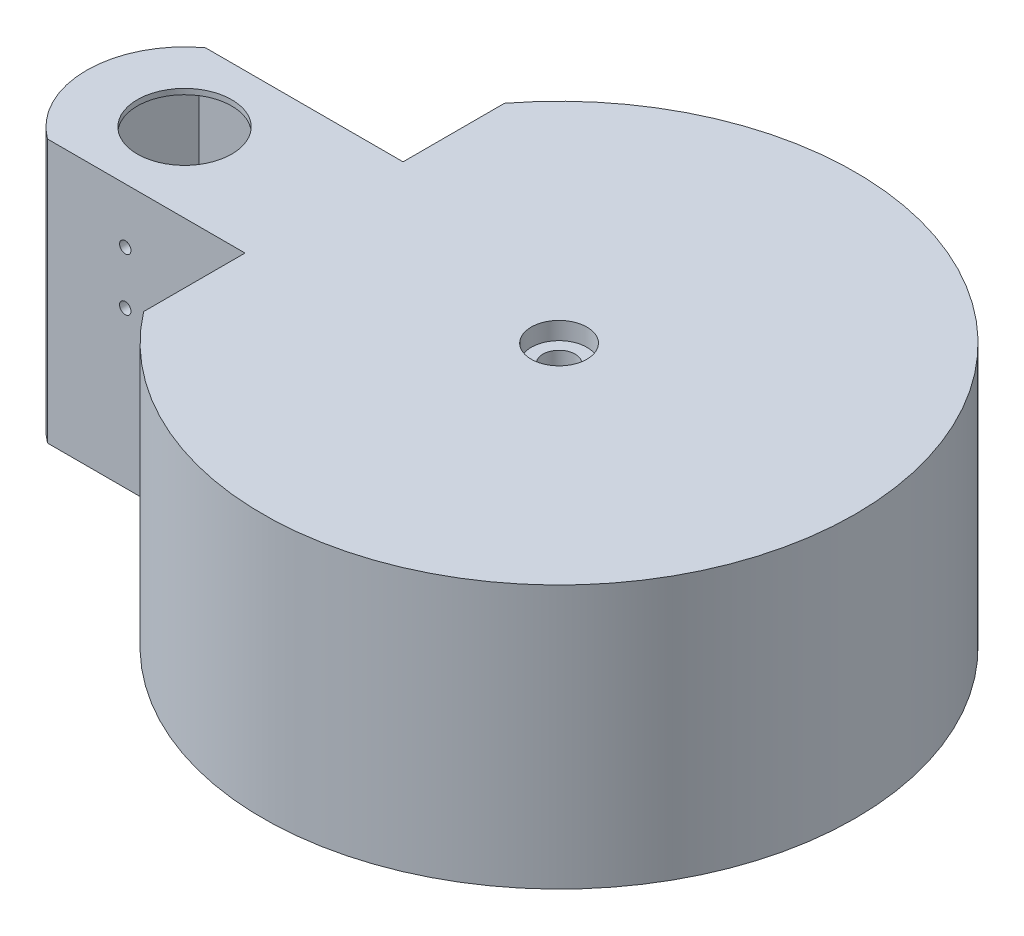
ISO-10303-21;
HEADER;
FILE_DESCRIPTION(('STEP AP214'),'2;1');
FILE_NAME('part.step','',(''),(''),'','','');
FILE_SCHEMA(('AUTOMOTIVE_DESIGN { 1 0 10303 214 1 1 1 1 }'));
ENDSEC;
DATA;
#1=APPLICATION_CONTEXT('core data for automotive mechanical design processes');
#2=APPLICATION_PROTOCOL_DEFINITION('international standard','automotive_design',2000,#1);
#3=PRODUCT_CONTEXT('',#1,'mechanical');
#4=PRODUCT('Part','Part','',(#3));
#5=PRODUCT_RELATED_PRODUCT_CATEGORY('part','',(#4));
#6=PRODUCT_DEFINITION_FORMATION('','',#4);
#7=PRODUCT_DEFINITION_CONTEXT('part definition',#1,'design');
#8=PRODUCT_DEFINITION('design','',#6,#7);
#9=PRODUCT_DEFINITION_SHAPE('','',#8);
#10=(LENGTH_UNIT() NAMED_UNIT(*) SI_UNIT(.MILLI.,.METRE.));
#11=(NAMED_UNIT(*) PLANE_ANGLE_UNIT() SI_UNIT($,.RADIAN.));
#12=(NAMED_UNIT(*) SI_UNIT($,.STERADIAN.) SOLID_ANGLE_UNIT());
#13=UNCERTAINTY_MEASURE_WITH_UNIT(LENGTH_MEASURE(1.E-05),#10,'distance_accuracy_value','');
#14=(GEOMETRIC_REPRESENTATION_CONTEXT(3) GLOBAL_UNCERTAINTY_ASSIGNED_CONTEXT((#13)) GLOBAL_UNIT_ASSIGNED_CONTEXT((#10,
#11,#12)) REPRESENTATION_CONTEXT('',''));
#15=CARTESIAN_POINT('',(0.,0.,0.));
#16=DIRECTION('',(0.,0.,1.));
#17=DIRECTION('',(1.,0.,0.));
#18=AXIS2_PLACEMENT_3D('',#15,#16,#17);
#19=CARTESIAN_POINT('',(0.,60.,0.));
#20=DIRECTION('',(0.,-1.,0.));
#21=DIRECTION('',(0.,0.,-1.));
#22=AXIS2_PLACEMENT_3D('',#19,#20,#21);
#23=CYLINDRICAL_SURFACE('',#22,3.675);
#24=CARTESIAN_POINT('',(0.,4.,0.));
#25=DIRECTION('',(0.,-1.,0.));
#26=DIRECTION('',(0.,0.,-1.));
#27=AXIS2_PLACEMENT_3D('',#24,#25,#26);
#28=CIRCLE('',#27,3.675);
#29=CARTESIAN_POINT('',(0.,4.,-3.675));
#30=VERTEX_POINT('',#29);
#31=EDGE_CURVE('E174',#30,#30,#28,.T.);
#32=ORIENTED_EDGE('',*,*,#31,.T.);
#33=EDGE_LOOP('',(#32));
#34=FACE_BOUND('',#33,.T.);
#35=CARTESIAN_POINT('',(0.,56.,0.));
#36=DIRECTION('',(0.,1.,0.));
#37=DIRECTION('',(0.,0.,1.));
#38=AXIS2_PLACEMENT_3D('',#35,#36,#37);
#39=CIRCLE('',#38,3.675);
#40=CARTESIAN_POINT('',(0.,56.,3.675));
#41=VERTEX_POINT('',#40);
#42=EDGE_CURVE('E45',#41,#41,#39,.T.);
#43=ORIENTED_EDGE('',*,*,#42,.T.);
#44=EDGE_LOOP('',(#43));
#45=FACE_BOUND('',#44,.T.);
#46=ADVANCED_FACE('F41',(#34,#45),#23,.F.);
#47=CARTESIAN_POINT('',(0.,60.,18.));
#48=DIRECTION('',(0.,0.,-1.));
#49=DIRECTION('',(-1.,0.,0.));
#50=AXIS2_PLACEMENT_3D('',#47,#48,#49);
#51=PLANE('',#50);
#52=CARTESIAN_POINT('',(-56.83,47.5,18.));
#53=DIRECTION('',(0.,0.,-1.));
#54=DIRECTION('',(-1.,0.,0.));
#55=AXIS2_PLACEMENT_3D('',#52,#53,#54);
#56=CIRCLE('',#55,1.29999999999999);
#57=CARTESIAN_POINT('',(-58.13,47.5,18.));
#58=VERTEX_POINT('',#57);
#59=EDGE_CURVE('E199',#58,#58,#56,.T.);
#60=ORIENTED_EDGE('',*,*,#59,.T.);
#61=EDGE_LOOP('',(#60));
#62=FACE_BOUND('',#61,.T.);
#63=CARTESIAN_POINT('',(-80.83,47.5,18.));
#64=DIRECTION('',(0.,0.,-1.));
#65=DIRECTION('',(-1.,0.,0.));
#66=AXIS2_PLACEMENT_3D('',#63,#64,#65);
#67=CIRCLE('',#66,1.29999999999999);
#68=CARTESIAN_POINT('',(-82.13,47.5,18.));
#69=VERTEX_POINT('',#68);
#70=EDGE_CURVE('E206',#69,#69,#67,.T.);
#71=ORIENTED_EDGE('',*,*,#70,.T.);
#72=EDGE_LOOP('',(#71));
#73=FACE_BOUND('',#72,.T.);
#74=CARTESIAN_POINT('',(-80.83,35.5,18.));
#75=DIRECTION('',(0.,0.,-1.));
#76=DIRECTION('',(-1.,0.,0.));
#77=AXIS2_PLACEMENT_3D('',#74,#75,#76);
#78=CIRCLE('',#77,1.29999999999999);
#79=CARTESIAN_POINT('',(-82.13,35.5,18.));
#80=VERTEX_POINT('',#79);
#81=EDGE_CURVE('E218',#80,#80,#78,.T.);
#82=ORIENTED_EDGE('',*,*,#81,.T.);
#83=EDGE_LOOP('',(#82));
#84=FACE_BOUND('',#83,.T.);
#85=CARTESIAN_POINT('',(-56.83,35.5,18.));
#86=DIRECTION('',(0.,0.,-1.));
#87=DIRECTION('',(-1.,0.,0.));
#88=AXIS2_PLACEMENT_3D('',#85,#86,#87);
#89=CIRCLE('',#88,1.29999999999999);
#90=CARTESIAN_POINT('',(-58.13,35.5,18.));
#91=VERTEX_POINT('',#90);
#92=EDGE_CURVE('E225',#91,#91,#89,.T.);
#93=ORIENTED_EDGE('',*,*,#92,.T.);
#94=EDGE_LOOP('',(#93));
#95=FACE_BOUND('',#94,.T.);
#96=DIRECTION('',(1.,0.,0.));
#97=VECTOR('',#96,1.);
#98=CARTESIAN_POINT('',(0.,0.,18.));
#99=LINE('',#98,#97);
#100=CARTESIAN_POINT('',(-98.5447228499125,0.,18.));
#101=VERTEX_POINT('',#100);
#102=CARTESIAN_POINT('',(-53.5447228499125,0.,18.));
#103=VERTEX_POINT('',#102);
#104=EDGE_CURVE('E143',#101,#103,#99,.T.);
#105=ORIENTED_EDGE('',*,*,#104,.T.);
#106=DIRECTION('',(0.,-1.,0.));
#107=VECTOR('',#106,1.);
#108=CARTESIAN_POINT('',(-53.5447228499125,60.,18.));
#109=LINE('',#108,#107);
#110=CARTESIAN_POINT('',(-53.5447228499125,60.,18.));
#111=VERTEX_POINT('',#110);
#112=EDGE_CURVE('E12',#111,#103,#109,.T.);
#113=ORIENTED_EDGE('',*,*,#112,.F.);
#114=DIRECTION('',(1.,0.,0.));
#115=VECTOR('',#114,1.);
#116=CARTESIAN_POINT('',(0.,60.,18.));
#117=LINE('',#116,#115);
#118=CARTESIAN_POINT('',(-98.5447228499125,60.,18.));
#119=VERTEX_POINT('',#118);
#120=EDGE_CURVE('E156',#119,#111,#117,.T.);
#121=ORIENTED_EDGE('',*,*,#120,.F.);
#122=DIRECTION('',(0.,-1.,0.));
#123=VECTOR('',#122,1.);
#124=CARTESIAN_POINT('',(-98.5447228499125,60.,18.));
#125=LINE('',#124,#123);
#126=EDGE_CURVE('E142',#119,#101,#125,.T.);
#127=ORIENTED_EDGE('',*,*,#126,.T.);
#128=EDGE_LOOP('',(#105,#113,#121,#127));
#129=FACE_BOUND('',#128,.T.);
#130=ADVANCED_FACE('F43',(#62,#73,#84,#95,#129),#51,.F.);
#131=CARTESIAN_POINT('',(-53.5447228499125,60.,0.));
#132=DIRECTION('',(1.,0.,0.));
#133=DIRECTION('',(0.,0.,-1.));
#134=AXIS2_PLACEMENT_3D('',#131,#132,#133);
#135=PLANE('',#134);
#136=DIRECTION('',(0.,0.,1.));
#137=VECTOR('',#136,1.);
#138=CARTESIAN_POINT('',(-53.5447228499125,0.,0.));
#139=LINE('',#138,#137);
#140=CARTESIAN_POINT('',(-53.5447228499125,0.,41.1000322983578));
#141=VERTEX_POINT('',#140);
#142=EDGE_CURVE('E146',#103,#141,#139,.T.);
#143=ORIENTED_EDGE('',*,*,#142,.T.);
#144=DIRECTION('',(0.,-1.,0.));
#145=VECTOR('',#144,1.);
#146=CARTESIAN_POINT('',(-53.5447228499125,60.,41.1000322983578));
#147=LINE('',#146,#145);
#148=CARTESIAN_POINT('',(-53.5447228499125,60.,41.1000322983578));
#149=VERTEX_POINT('',#148);
#150=EDGE_CURVE('E50',#149,#141,#147,.T.);
#151=ORIENTED_EDGE('',*,*,#150,.F.);
#152=DIRECTION('',(0.,0.,1.));
#153=VECTOR('',#152,1.);
#154=CARTESIAN_POINT('',(-53.5447228499125,60.,0.));
#155=LINE('',#154,#153);
#156=EDGE_CURVE('E102',#111,#149,#155,.T.);
#157=ORIENTED_EDGE('',*,*,#156,.F.);
#158=ORIENTED_EDGE('',*,*,#112,.T.);
#159=EDGE_LOOP('',(#143,#151,#157,#158));
#160=FACE_BOUND('',#159,.T.);
#161=ADVANCED_FACE('F262',(#160),#135,.F.);
#162=CARTESIAN_POINT('',(0.,60.,0.));
#163=DIRECTION('',(0.,-1.,0.));
#164=DIRECTION('',(0.,0.,-1.));
#165=AXIS2_PLACEMENT_3D('',#162,#163,#164);
#166=CYLINDRICAL_SURFACE('',#165,67.5);
#167=CARTESIAN_POINT('',(0.,0.,0.));
#168=DIRECTION('',(0.,1.,0.));
#169=DIRECTION('',(0.,0.,1.));
#170=AXIS2_PLACEMENT_3D('',#167,#168,#169);
#171=CIRCLE('',#170,67.5);
#172=CARTESIAN_POINT('',(-53.5447228499125,0.,-41.1000322983578));
#173=VERTEX_POINT('',#172);
#174=EDGE_CURVE('E149',#141,#173,#171,.T.);
#175=ORIENTED_EDGE('',*,*,#174,.T.);
#176=DIRECTION('',(0.,-1.,0.));
#177=VECTOR('',#176,1.);
#178=CARTESIAN_POINT('',(-53.5447228499125,60.,-41.1000322983578));
#179=LINE('',#178,#177);
#180=CARTESIAN_POINT('',(-53.5447228499125,60.,-41.1000322983578));
#181=VERTEX_POINT('',#180);
#182=EDGE_CURVE('E124',#181,#173,#179,.T.);
#183=ORIENTED_EDGE('',*,*,#182,.F.);
#184=CARTESIAN_POINT('',(0.,60.,0.));
#185=DIRECTION('',(0.,1.,0.));
#186=DIRECTION('',(0.,0.,1.));
#187=AXIS2_PLACEMENT_3D('',#184,#185,#186);
#188=CIRCLE('',#187,67.5);
#189=EDGE_CURVE('E131',#149,#181,#188,.T.);
#190=ORIENTED_EDGE('',*,*,#189,.F.);
#191=ORIENTED_EDGE('',*,*,#150,.T.);
#192=EDGE_LOOP('',(#175,#183,#190,#191));
#193=FACE_BOUND('',#192,.T.);
#194=ADVANCED_FACE('F265',(#193),#166,.T.);
#195=CARTESIAN_POINT('',(-53.5447228499125,60.,0.));
#196=DIRECTION('',(-1.,0.,0.));
#197=DIRECTION('',(0.,0.,1.));
#198=AXIS2_PLACEMENT_3D('',#195,#196,#197);
#199=PLANE('',#198);
#200=DIRECTION('',(0.,0.,-1.));
#201=VECTOR('',#200,1.);
#202=CARTESIAN_POINT('',(-53.5447228499125,0.,0.));
#203=LINE('',#202,#201);
#204=CARTESIAN_POINT('',(-53.5447228499125,0.,-18.));
#205=VERTEX_POINT('',#204);
#206=EDGE_CURVE('E119',#205,#173,#203,.T.);
#207=ORIENTED_EDGE('',*,*,#206,.F.);
#208=DIRECTION('',(0.,-1.,0.));
#209=VECTOR('',#208,1.);
#210=CARTESIAN_POINT('',(-53.5447228499125,60.,-18.));
#211=LINE('',#210,#209);
#212=CARTESIAN_POINT('',(-53.5447228499125,60.,-18.));
#213=VERTEX_POINT('',#212);
#214=EDGE_CURVE('E114',#213,#205,#211,.T.);
#215=ORIENTED_EDGE('',*,*,#214,.F.);
#216=DIRECTION('',(0.,0.,-1.));
#217=VECTOR('',#216,1.);
#218=CARTESIAN_POINT('',(-53.5447228499125,60.,0.));
#219=LINE('',#218,#217);
#220=EDGE_CURVE('E117',#213,#181,#219,.T.);
#221=ORIENTED_EDGE('',*,*,#220,.T.);
#222=ORIENTED_EDGE('',*,*,#182,.T.);
#223=EDGE_LOOP('',(#207,#215,#221,#222));
#224=FACE_BOUND('',#223,.T.);
#225=ADVANCED_FACE('F116',(#224),#199,.T.);
#226=CARTESIAN_POINT('',(0.,60.,-18.));
#227=DIRECTION('',(0.,0.,-1.));
#228=DIRECTION('',(-1.,0.,0.));
#229=AXIS2_PLACEMENT_3D('',#226,#227,#228);
#230=PLANE('',#229);
#231=CARTESIAN_POINT('',(-56.83,47.5,-18.));
#232=DIRECTION('',(0.,0.,-1.));
#233=DIRECTION('',(-1.,0.,0.));
#234=AXIS2_PLACEMENT_3D('',#231,#232,#233);
#235=CIRCLE('',#234,1.29999999999999);
#236=CARTESIAN_POINT('',(-58.13,47.5,-18.));
#237=VERTEX_POINT('',#236);
#238=EDGE_CURVE('E176',#237,#237,#235,.T.);
#239=ORIENTED_EDGE('',*,*,#238,.F.);
#240=EDGE_LOOP('',(#239));
#241=FACE_BOUND('',#240,.T.);
#242=CARTESIAN_POINT('',(-80.83,47.5,-18.));
#243=DIRECTION('',(0.,0.,-1.));
#244=DIRECTION('',(-1.,0.,0.));
#245=AXIS2_PLACEMENT_3D('',#242,#243,#244);
#246=CIRCLE('',#245,1.29999999999998);
#247=CARTESIAN_POINT('',(-82.13,47.5,-18.));
#248=VERTEX_POINT('',#247);
#249=EDGE_CURVE('E173',#248,#248,#246,.T.);
#250=ORIENTED_EDGE('',*,*,#249,.F.);
#251=EDGE_LOOP('',(#250));
#252=FACE_BOUND('',#251,.T.);
#253=CARTESIAN_POINT('',(-80.83,35.5,-18.));
#254=DIRECTION('',(0.,0.,-1.));
#255=DIRECTION('',(-1.,0.,0.));
#256=AXIS2_PLACEMENT_3D('',#253,#254,#255);
#257=CIRCLE('',#256,1.29999999999998);
#258=CARTESIAN_POINT('',(-82.13,35.5,-18.));
#259=VERTEX_POINT('',#258);
#260=EDGE_CURVE('E209',#259,#259,#257,.T.);
#261=ORIENTED_EDGE('',*,*,#260,.F.);
#262=EDGE_LOOP('',(#261));
#263=FACE_BOUND('',#262,.T.);
#264=CARTESIAN_POINT('',(-56.83,35.5,-18.));
#265=DIRECTION('',(0.,0.,-1.));
#266=DIRECTION('',(-1.,0.,0.));
#267=AXIS2_PLACEMENT_3D('',#264,#265,#266);
#268=CIRCLE('',#267,1.29999999999999);
#269=CARTESIAN_POINT('',(-58.13,35.5,-18.));
#270=VERTEX_POINT('',#269);
#271=EDGE_CURVE('E169',#270,#270,#268,.T.);
#272=ORIENTED_EDGE('',*,*,#271,.F.);
#273=EDGE_LOOP('',(#272));
#274=FACE_BOUND('',#273,.T.);
#275=DIRECTION('',(1.,0.,0.));
#276=VECTOR('',#275,1.);
#277=CARTESIAN_POINT('',(0.,0.,-18.));
#278=LINE('',#277,#276);
#279=CARTESIAN_POINT('',(-98.5447228499125,0.,-18.));
#280=VERTEX_POINT('',#279);
#281=EDGE_CURVE('E153',#280,#205,#278,.T.);
#282=ORIENTED_EDGE('',*,*,#281,.F.);
#283=DIRECTION('',(0.,-1.,0.));
#284=VECTOR('',#283,1.);
#285=CARTESIAN_POINT('',(-98.5447228499125,60.,-18.));
#286=LINE('',#285,#284);
#287=CARTESIAN_POINT('',(-98.5447228499125,60.,-18.));
#288=VERTEX_POINT('',#287);
#289=EDGE_CURVE('E125',#288,#280,#286,.T.);
#290=ORIENTED_EDGE('',*,*,#289,.F.);
#291=DIRECTION('',(1.,0.,0.));
#292=VECTOR('',#291,1.);
#293=CARTESIAN_POINT('',(0.,60.,-18.));
#294=LINE('',#293,#292);
#295=EDGE_CURVE('E129',#288,#213,#294,.T.);
#296=ORIENTED_EDGE('',*,*,#295,.T.);
#297=ORIENTED_EDGE('',*,*,#214,.T.);
#298=EDGE_LOOP('',(#282,#290,#296,#297));
#299=FACE_BOUND('',#298,.T.);
#300=ADVANCED_FACE('F134',(#241,#252,#263,#274,#299),#230,.T.);
#301=CARTESIAN_POINT('',(-85.33,60.,0.));
#302=DIRECTION('',(0.,-1.,0.));
#303=DIRECTION('',(0.,0.,-1.));
#304=AXIS2_PLACEMENT_3D('',#301,#302,#303);
#305=CYLINDRICAL_SURFACE('',#304,10.75);
#306=CARTESIAN_POINT('',(-85.33,58.75,0.));
#307=DIRECTION('',(0.,1.,0.));
#308=DIRECTION('',(0.,0.,1.));
#309=AXIS2_PLACEMENT_3D('',#306,#307,#308);
#310=CIRCLE('',#309,10.75);
#311=CARTESIAN_POINT('',(-85.33,58.75,10.75));
#312=VERTEX_POINT('',#311);
#313=EDGE_CURVE('E147',#312,#312,#310,.T.);
#314=ORIENTED_EDGE('',*,*,#313,.F.);
#315=EDGE_LOOP('',(#314));
#316=FACE_BOUND('',#315,.T.);
#317=CARTESIAN_POINT('',(-85.33,60.,0.));
#318=DIRECTION('',(0.,1.,0.));
#319=DIRECTION('',(0.,0.,1.));
#320=AXIS2_PLACEMENT_3D('',#317,#318,#319);
#321=CIRCLE('',#320,10.75);
#322=CARTESIAN_POINT('',(-85.33,60.,10.75));
#323=VERTEX_POINT('',#322);
#324=EDGE_CURVE('E136',#323,#323,#321,.T.);
#325=ORIENTED_EDGE('',*,*,#324,.T.);
#326=EDGE_LOOP('',(#325));
#327=FACE_BOUND('',#326,.T.);
#328=ADVANCED_FACE('F272',(#316,#327),#305,.F.);
#329=CARTESIAN_POINT('',(-85.33,60.,0.));
#330=DIRECTION('',(0.,-1.,0.));
#331=DIRECTION('',(0.,0.,-1.));
#332=AXIS2_PLACEMENT_3D('',#329,#330,#331);
#333=CYLINDRICAL_SURFACE('',#332,22.33);
#334=CARTESIAN_POINT('',(-85.33,0.,0.));
#335=DIRECTION('',(0.,1.,0.));
#336=DIRECTION('',(0.,0.,1.));
#337=AXIS2_PLACEMENT_3D('',#334,#335,#336);
#338=CIRCLE('',#337,22.33);
#339=EDGE_CURVE('E94',#280,#101,#338,.T.);
#340=ORIENTED_EDGE('',*,*,#339,.T.);
#341=ORIENTED_EDGE('',*,*,#126,.F.);
#342=CARTESIAN_POINT('',(-85.33,60.,0.));
#343=DIRECTION('',(0.,1.,0.));
#344=DIRECTION('',(0.,0.,1.));
#345=AXIS2_PLACEMENT_3D('',#342,#343,#344);
#346=CIRCLE('',#345,22.33);
#347=EDGE_CURVE('E67',#288,#119,#346,.T.);
#348=ORIENTED_EDGE('',*,*,#347,.F.);
#349=ORIENTED_EDGE('',*,*,#289,.T.);
#350=EDGE_LOOP('',(#340,#341,#348,#349));
#351=FACE_BOUND('',#350,.T.);
#352=ADVANCED_FACE('F270',(#351),#333,.T.);
#353=CARTESIAN_POINT('',(0.,60.,0.));
#354=DIRECTION('',(0.,1.,0.));
#355=DIRECTION('',(0.,0.,1.));
#356=AXIS2_PLACEMENT_3D('',#353,#354,#355);
#357=PLANE('',#356);
#358=CARTESIAN_POINT('',(0.,60.,0.));
#359=DIRECTION('',(0.,1.,0.));
#360=DIRECTION('',(0.,0.,1.));
#361=AXIS2_PLACEMENT_3D('',#358,#359,#360);
#362=CIRCLE('',#361,6.35);
#363=CARTESIAN_POINT('',(0.,60.,6.35));
#364=VERTEX_POINT('',#363);
#365=EDGE_CURVE('E191',#364,#364,#362,.T.);
#366=ORIENTED_EDGE('',*,*,#365,.F.);
#367=EDGE_LOOP('',(#366));
#368=FACE_BOUND('',#367,.T.);
#369=ORIENTED_EDGE('',*,*,#120,.T.);
#370=ORIENTED_EDGE('',*,*,#156,.T.);
#371=ORIENTED_EDGE('',*,*,#189,.T.);
#372=ORIENTED_EDGE('',*,*,#220,.F.);
#373=ORIENTED_EDGE('',*,*,#295,.F.);
#374=ORIENTED_EDGE('',*,*,#347,.T.);
#375=EDGE_LOOP('',(#369,#370,#371,#372,#373,#374));
#376=FACE_BOUND('',#375,.T.);
#377=ORIENTED_EDGE('',*,*,#324,.F.);
#378=EDGE_LOOP('',(#377));
#379=FACE_BOUND('',#378,.T.);
#380=ADVANCED_FACE('F127',(#368,#376,#379),#357,.T.);
#381=CARTESIAN_POINT('',(0.,0.,0.));
#382=DIRECTION('',(0.,1.,0.));
#383=DIRECTION('',(0.,0.,1.));
#384=AXIS2_PLACEMENT_3D('',#381,#382,#383);
#385=PLANE('',#384);
#386=CARTESIAN_POINT('',(0.,0.,0.));
#387=DIRECTION('',(0.,-1.,0.));
#388=DIRECTION('',(0.,0.,-1.));
#389=AXIS2_PLACEMENT_3D('',#386,#387,#388);
#390=CIRCLE('',#389,6.35);
#391=CARTESIAN_POINT('',(0.,0.,-6.35));
#392=VERTEX_POINT('',#391);
#393=EDGE_CURVE('E184',#392,#392,#390,.T.);
#394=ORIENTED_EDGE('',*,*,#393,.F.);
#395=EDGE_LOOP('',(#394));
#396=FACE_BOUND('',#395,.T.);
#397=DIRECTION('',(0.,0.,1.));
#398=VECTOR('',#397,1.);
#399=CARTESIAN_POINT('',(-46.58,0.,14.5));
#400=LINE('',#399,#398);
#401=CARTESIAN_POINT('',(-46.58,0.,-14.5));
#402=VERTEX_POINT('',#401);
#403=CARTESIAN_POINT('',(-46.58,0.,14.5));
#404=VERTEX_POINT('',#403);
#405=EDGE_CURVE('E231',#402,#404,#400,.T.);
#406=ORIENTED_EDGE('',*,*,#405,.F.);
#407=DIRECTION('',(1.,0.,0.));
#408=VECTOR('',#407,1.);
#409=CARTESIAN_POINT('',(-96.58,0.,-14.5));
#410=LINE('',#409,#408);
#411=CARTESIAN_POINT('',(-96.58,0.,-14.5));
#412=VERTEX_POINT('',#411);
#413=EDGE_CURVE('E234',#412,#402,#410,.T.);
#414=ORIENTED_EDGE('',*,*,#413,.F.);
#415=DIRECTION('',(0.,0.,-1.));
#416=VECTOR('',#415,1.);
#417=CARTESIAN_POINT('',(-96.58,0.,14.5));
#418=LINE('',#417,#416);
#419=CARTESIAN_POINT('',(-96.58,0.,14.5));
#420=VERTEX_POINT('',#419);
#421=EDGE_CURVE('E228',#420,#412,#418,.T.);
#422=ORIENTED_EDGE('',*,*,#421,.F.);
#423=DIRECTION('',(-1.,0.,0.));
#424=VECTOR('',#423,1.);
#425=CARTESIAN_POINT('',(-96.58,0.,14.5));
#426=LINE('',#425,#424);
#427=EDGE_CURVE('E58',#404,#420,#426,.T.);
#428=ORIENTED_EDGE('',*,*,#427,.F.);
#429=EDGE_LOOP('',(#406,#414,#422,#428));
#430=FACE_BOUND('',#429,.T.);
#431=ORIENTED_EDGE('',*,*,#104,.F.);
#432=ORIENTED_EDGE('',*,*,#339,.F.);
#433=ORIENTED_EDGE('',*,*,#281,.T.);
#434=ORIENTED_EDGE('',*,*,#206,.T.);
#435=ORIENTED_EDGE('',*,*,#174,.F.);
#436=ORIENTED_EDGE('',*,*,#142,.F.);
#437=EDGE_LOOP('',(#431,#432,#433,#434,#435,#436));
#438=FACE_BOUND('',#437,.T.);
#439=ADVANCED_FACE('F268',(#396,#430,#438),#385,.F.);
#440=CARTESIAN_POINT('',(0.,58.75,0.));
#441=DIRECTION('',(0.,1.,0.));
#442=DIRECTION('',(0.,0.,1.));
#443=AXIS2_PLACEMENT_3D('',#440,#441,#442);
#444=PLANE('',#443);
#445=ORIENTED_EDGE('',*,*,#313,.T.);
#446=EDGE_LOOP('',(#445));
#447=FACE_BOUND('',#446,.T.);
#448=DIRECTION('',(0.,0.,-1.));
#449=VECTOR('',#448,1.);
#450=CARTESIAN_POINT('',(-96.58,58.75,14.5));
#451=LINE('',#450,#449);
#452=CARTESIAN_POINT('',(-96.58,58.75,14.5));
#453=VERTEX_POINT('',#452);
#454=CARTESIAN_POINT('',(-96.58,58.75,-14.5));
#455=VERTEX_POINT('',#454);
#456=EDGE_CURVE('E242',#453,#455,#451,.T.);
#457=ORIENTED_EDGE('',*,*,#456,.T.);
#458=DIRECTION('',(1.,0.,0.));
#459=VECTOR('',#458,1.);
#460=CARTESIAN_POINT('',(-96.58,58.75,-14.5));
#461=LINE('',#460,#459);
#462=CARTESIAN_POINT('',(-46.58,58.75,-14.5));
#463=VERTEX_POINT('',#462);
#464=EDGE_CURVE('E230',#455,#463,#461,.T.);
#465=ORIENTED_EDGE('',*,*,#464,.T.);
#466=DIRECTION('',(0.,0.,1.));
#467=VECTOR('',#466,1.);
#468=CARTESIAN_POINT('',(-46.58,58.75,14.5));
#469=LINE('',#468,#467);
#470=CARTESIAN_POINT('',(-46.58,58.75,14.5));
#471=VERTEX_POINT('',#470);
#472=EDGE_CURVE('E250',#463,#471,#469,.T.);
#473=ORIENTED_EDGE('',*,*,#472,.T.);
#474=DIRECTION('',(-1.,0.,0.));
#475=VECTOR('',#474,1.);
#476=CARTESIAN_POINT('',(-96.58,58.75,14.5));
#477=LINE('',#476,#475);
#478=EDGE_CURVE('E246',#471,#453,#477,.T.);
#479=ORIENTED_EDGE('',*,*,#478,.T.);
#480=EDGE_LOOP('',(#457,#465,#473,#479));
#481=FACE_BOUND('',#480,.T.);
#482=ADVANCED_FACE('F292',(#447,#481),#444,.F.);
#483=CARTESIAN_POINT('',(-96.58,117.801384066474,-14.5));
#484=DIRECTION('',(0.,0.,-1.));
#485=DIRECTION('',(-1.,0.,0.));
#486=AXIS2_PLACEMENT_3D('',#483,#484,#485);
#487=PLANE('',#486);
#488=CARTESIAN_POINT('',(-56.83,47.5,-14.5));
#489=DIRECTION('',(0.,0.,-1.));
#490=DIRECTION('',(-1.,0.,0.));
#491=AXIS2_PLACEMENT_3D('',#488,#489,#490);
#492=CIRCLE('',#491,1.29999999999999);
#493=CARTESIAN_POINT('',(-58.13,47.5,-14.5));
#494=VERTEX_POINT('',#493);
#495=EDGE_CURVE('E181',#494,#494,#492,.T.);
#496=ORIENTED_EDGE('',*,*,#495,.T.);
#497=EDGE_LOOP('',(#496));
#498=FACE_BOUND('',#497,.T.);
#499=CARTESIAN_POINT('',(-80.83,47.5,-14.5));
#500=DIRECTION('',(0.,0.,-1.));
#501=DIRECTION('',(-1.,0.,0.));
#502=AXIS2_PLACEMENT_3D('',#499,#500,#501);
#503=CIRCLE('',#502,1.29999999999999);
#504=CARTESIAN_POINT('',(-82.13,47.5,-14.5));
#505=VERTEX_POINT('',#504);
#506=EDGE_CURVE('E170',#505,#505,#503,.T.);
#507=ORIENTED_EDGE('',*,*,#506,.T.);
#508=EDGE_LOOP('',(#507));
#509=FACE_BOUND('',#508,.T.);
#510=CARTESIAN_POINT('',(-80.83,35.5,-14.5));
#511=DIRECTION('',(0.,0.,-1.));
#512=DIRECTION('',(-1.,0.,0.));
#513=AXIS2_PLACEMENT_3D('',#510,#511,#512);
#514=CIRCLE('',#513,1.29999999999999);
#515=CARTESIAN_POINT('',(-82.13,35.5,-14.5));
#516=VERTEX_POINT('',#515);
#517=EDGE_CURVE('E215',#516,#516,#514,.T.);
#518=ORIENTED_EDGE('',*,*,#517,.T.);
#519=EDGE_LOOP('',(#518));
#520=FACE_BOUND('',#519,.T.);
#521=CARTESIAN_POINT('',(-56.83,35.5,-14.5));
#522=DIRECTION('',(0.,0.,-1.));
#523=DIRECTION('',(-1.,0.,0.));
#524=AXIS2_PLACEMENT_3D('',#521,#522,#523);
#525=CIRCLE('',#524,1.29999999999999);
#526=CARTESIAN_POINT('',(-58.13,35.5,-14.5));
#527=VERTEX_POINT('',#526);
#528=EDGE_CURVE('E165',#527,#527,#525,.T.);
#529=ORIENTED_EDGE('',*,*,#528,.T.);
#530=EDGE_LOOP('',(#529));
#531=FACE_BOUND('',#530,.T.);
#532=DIRECTION('',(0.,-1.,0.));
#533=VECTOR('',#532,1.);
#534=CARTESIAN_POINT('',(-96.58,117.801384066474,-14.5));
#535=LINE('',#534,#533);
#536=EDGE_CURVE('E164',#455,#412,#535,.T.);
#537=ORIENTED_EDGE('',*,*,#536,.T.);
#538=ORIENTED_EDGE('',*,*,#413,.T.);
#539=DIRECTION('',(0.,-1.,0.));
#540=VECTOR('',#539,1.);
#541=CARTESIAN_POINT('',(-46.58,117.801384066474,-14.5));
#542=LINE('',#541,#540);
#543=EDGE_CURVE('E241',#463,#402,#542,.T.);
#544=ORIENTED_EDGE('',*,*,#543,.F.);
#545=ORIENTED_EDGE('',*,*,#464,.F.);
#546=EDGE_LOOP('',(#537,#538,#544,#545));
#547=FACE_BOUND('',#546,.T.);
#548=ADVANCED_FACE('F297',(#498,#509,#520,#531,#547),#487,.F.);
#549=CARTESIAN_POINT('',(-46.58,117.801384066474,14.5));
#550=DIRECTION('',(1.,0.,0.));
#551=DIRECTION('',(0.,0.,-1.));
#552=AXIS2_PLACEMENT_3D('',#549,#550,#551);
#553=PLANE('',#552);
#554=ORIENTED_EDGE('',*,*,#543,.T.);
#555=ORIENTED_EDGE('',*,*,#405,.T.);
#556=DIRECTION('',(0.,-1.,0.));
#557=VECTOR('',#556,1.);
#558=CARTESIAN_POINT('',(-46.58,117.801384066474,14.5));
#559=LINE('',#558,#557);
#560=EDGE_CURVE('E249',#471,#404,#559,.T.);
#561=ORIENTED_EDGE('',*,*,#560,.F.);
#562=ORIENTED_EDGE('',*,*,#472,.F.);
#563=EDGE_LOOP('',(#554,#555,#561,#562));
#564=FACE_BOUND('',#563,.T.);
#565=ADVANCED_FACE('F301',(#564),#553,.F.);
#566=CARTESIAN_POINT('',(-96.58,117.801384066474,14.5));
#567=DIRECTION('',(0.,0.,1.));
#568=DIRECTION('',(1.,0.,0.));
#569=AXIS2_PLACEMENT_3D('',#566,#567,#568);
#570=PLANE('',#569);
#571=CARTESIAN_POINT('',(-56.83,47.5,14.5));
#572=DIRECTION('',(0.,0.,1.));
#573=DIRECTION('',(1.,0.,0.));
#574=AXIS2_PLACEMENT_3D('',#571,#572,#573);
#575=CIRCLE('',#574,1.29999999999999);
#576=CARTESIAN_POINT('',(-55.53,47.5,14.5));
#577=VERTEX_POINT('',#576);
#578=EDGE_CURVE('E196',#577,#577,#575,.T.);
#579=ORIENTED_EDGE('',*,*,#578,.T.);
#580=EDGE_LOOP('',(#579));
#581=FACE_BOUND('',#580,.T.);
#582=CARTESIAN_POINT('',(-80.83,47.5,14.5));
#583=DIRECTION('',(0.,0.,1.));
#584=DIRECTION('',(1.,0.,0.));
#585=AXIS2_PLACEMENT_3D('',#582,#583,#584);
#586=CIRCLE('',#585,1.29999999999999);
#587=CARTESIAN_POINT('',(-79.53,47.5,14.5));
#588=VERTEX_POINT('',#587);
#589=EDGE_CURVE('E172',#588,#588,#586,.T.);
#590=ORIENTED_EDGE('',*,*,#589,.T.);
#591=EDGE_LOOP('',(#590));
#592=FACE_BOUND('',#591,.T.);
#593=CARTESIAN_POINT('',(-80.83,35.5,14.5));
#594=DIRECTION('',(0.,0.,1.));
#595=DIRECTION('',(1.,0.,0.));
#596=AXIS2_PLACEMENT_3D('',#593,#594,#595);
#597=CIRCLE('',#596,1.29999999999999);
#598=CARTESIAN_POINT('',(-79.53,35.5,14.5));
#599=VERTEX_POINT('',#598);
#600=EDGE_CURVE('E212',#599,#599,#597,.T.);
#601=ORIENTED_EDGE('',*,*,#600,.T.);
#602=EDGE_LOOP('',(#601));
#603=FACE_BOUND('',#602,.T.);
#604=CARTESIAN_POINT('',(-56.83,35.5,14.5));
#605=DIRECTION('',(0.,0.,1.));
#606=DIRECTION('',(1.,0.,0.));
#607=AXIS2_PLACEMENT_3D('',#604,#605,#606);
#608=CIRCLE('',#607,1.29999999999999);
#609=CARTESIAN_POINT('',(-55.53,35.5,14.5));
#610=VERTEX_POINT('',#609);
#611=EDGE_CURVE('E168',#610,#610,#608,.T.);
#612=ORIENTED_EDGE('',*,*,#611,.T.);
#613=EDGE_LOOP('',(#612));
#614=FACE_BOUND('',#613,.T.);
#615=ORIENTED_EDGE('',*,*,#560,.T.);
#616=ORIENTED_EDGE('',*,*,#427,.T.);
#617=DIRECTION('',(0.,-1.,0.));
#618=VECTOR('',#617,1.);
#619=CARTESIAN_POINT('',(-96.58,117.801384066474,14.5));
#620=LINE('',#619,#618);
#621=EDGE_CURVE('E245',#453,#420,#620,.T.);
#622=ORIENTED_EDGE('',*,*,#621,.F.);
#623=ORIENTED_EDGE('',*,*,#478,.F.);
#624=EDGE_LOOP('',(#615,#616,#622,#623));
#625=FACE_BOUND('',#624,.T.);
#626=ADVANCED_FACE('F305',(#581,#592,#603,#614,#625),#570,.F.);
#627=CARTESIAN_POINT('',(-96.58,117.801384066474,14.5));
#628=DIRECTION('',(-1.,0.,0.));
#629=DIRECTION('',(0.,0.,1.));
#630=AXIS2_PLACEMENT_3D('',#627,#628,#629);
#631=PLANE('',#630);
#632=ORIENTED_EDGE('',*,*,#621,.T.);
#633=ORIENTED_EDGE('',*,*,#421,.T.);
#634=ORIENTED_EDGE('',*,*,#536,.F.);
#635=ORIENTED_EDGE('',*,*,#456,.F.);
#636=EDGE_LOOP('',(#632,#633,#634,#635));
#637=FACE_BOUND('',#636,.T.);
#638=ADVANCED_FACE('F309',(#637),#631,.F.);
#639=CARTESIAN_POINT('',(-56.83,35.5,-18.));
#640=DIRECTION('',(0.,0.,-1.));
#641=DIRECTION('',(-1.,0.,0.));
#642=AXIS2_PLACEMENT_3D('',#639,#640,#641);
#643=CYLINDRICAL_SURFACE('',#642,1.29999999999999);
#644=ORIENTED_EDGE('',*,*,#271,.T.);
#645=EDGE_LOOP('',(#644));
#646=FACE_BOUND('',#645,.T.);
#647=ORIENTED_EDGE('',*,*,#528,.F.);
#648=EDGE_LOOP('',(#647));
#649=FACE_BOUND('',#648,.T.);
#650=ADVANCED_FACE('F313',(#646,#649),#643,.F.);
#651=ORIENTED_EDGE('',*,*,#611,.F.);
#652=EDGE_LOOP('',(#651));
#653=FACE_BOUND('',#652,.T.);
#654=ORIENTED_EDGE('',*,*,#92,.F.);
#655=EDGE_LOOP('',(#654));
#656=FACE_BOUND('',#655,.T.);
#657=ADVANCED_FACE('F315',(#653,#656),#643,.F.);
#658=CARTESIAN_POINT('',(-80.83,35.5,-18.));
#659=DIRECTION('',(0.,0.,-1.));
#660=DIRECTION('',(-1.,0.,0.));
#661=AXIS2_PLACEMENT_3D('',#658,#659,#660);
#662=CYLINDRICAL_SURFACE('',#661,1.29999999999999);
#663=ORIENTED_EDGE('',*,*,#260,.T.);
#664=EDGE_LOOP('',(#663));
#665=FACE_BOUND('',#664,.T.);
#666=ORIENTED_EDGE('',*,*,#517,.F.);
#667=EDGE_LOOP('',(#666));
#668=FACE_BOUND('',#667,.T.);
#669=ADVANCED_FACE('F318',(#665,#668),#662,.F.);
#670=ORIENTED_EDGE('',*,*,#600,.F.);
#671=EDGE_LOOP('',(#670));
#672=FACE_BOUND('',#671,.T.);
#673=ORIENTED_EDGE('',*,*,#81,.F.);
#674=EDGE_LOOP('',(#673));
#675=FACE_BOUND('',#674,.T.);
#676=ADVANCED_FACE('F320',(#672,#675),#662,.F.);
#677=CARTESIAN_POINT('',(-80.83,47.5,-18.));
#678=DIRECTION('',(0.,0.,-1.));
#679=DIRECTION('',(-1.,0.,0.));
#680=AXIS2_PLACEMENT_3D('',#677,#678,#679);
#681=CYLINDRICAL_SURFACE('',#680,1.29999999999999);
#682=ORIENTED_EDGE('',*,*,#249,.T.);
#683=EDGE_LOOP('',(#682));
#684=FACE_BOUND('',#683,.T.);
#685=ORIENTED_EDGE('',*,*,#506,.F.);
#686=EDGE_LOOP('',(#685));
#687=FACE_BOUND('',#686,.T.);
#688=ADVANCED_FACE('F323',(#684,#687),#681,.F.);
#689=ORIENTED_EDGE('',*,*,#589,.F.);
#690=EDGE_LOOP('',(#689));
#691=FACE_BOUND('',#690,.T.);
#692=ORIENTED_EDGE('',*,*,#70,.F.);
#693=EDGE_LOOP('',(#692));
#694=FACE_BOUND('',#693,.T.);
#695=ADVANCED_FACE('F325',(#691,#694),#681,.F.);
#696=CARTESIAN_POINT('',(-56.83,47.5,-18.));
#697=DIRECTION('',(0.,0.,-1.));
#698=DIRECTION('',(-1.,0.,0.));
#699=AXIS2_PLACEMENT_3D('',#696,#697,#698);
#700=CYLINDRICAL_SURFACE('',#699,1.29999999999999);
#701=ORIENTED_EDGE('',*,*,#238,.T.);
#702=EDGE_LOOP('',(#701));
#703=FACE_BOUND('',#702,.T.);
#704=ORIENTED_EDGE('',*,*,#495,.F.);
#705=EDGE_LOOP('',(#704));
#706=FACE_BOUND('',#705,.T.);
#707=ADVANCED_FACE('F328',(#703,#706),#700,.F.);
#708=ORIENTED_EDGE('',*,*,#578,.F.);
#709=EDGE_LOOP('',(#708));
#710=FACE_BOUND('',#709,.T.);
#711=ORIENTED_EDGE('',*,*,#59,.F.);
#712=EDGE_LOOP('',(#711));
#713=FACE_BOUND('',#712,.T.);
#714=ADVANCED_FACE('F330',(#710,#713),#700,.F.);
#715=CARTESIAN_POINT('',(0.,4.,0.));
#716=DIRECTION('',(0.,-1.,0.));
#717=DIRECTION('',(0.,0.,-1.));
#718=AXIS2_PLACEMENT_3D('',#715,#716,#717);
#719=CYLINDRICAL_SURFACE('',#718,6.35);
#720=CARTESIAN_POINT('',(0.,4.,0.));
#721=DIRECTION('',(0.,-1.,0.));
#722=DIRECTION('',(0.,0.,-1.));
#723=AXIS2_PLACEMENT_3D('',#720,#721,#722);
#724=CIRCLE('',#723,6.35);
#725=CARTESIAN_POINT('',(0.,4.,-6.35));
#726=VERTEX_POINT('',#725);
#727=EDGE_CURVE('E177',#726,#726,#724,.T.);
#728=ORIENTED_EDGE('',*,*,#727,.F.);
#729=EDGE_LOOP('',(#728));
#730=FACE_BOUND('',#729,.T.);
#731=ORIENTED_EDGE('',*,*,#393,.T.);
#732=EDGE_LOOP('',(#731));
#733=FACE_BOUND('',#732,.T.);
#734=ADVANCED_FACE('F333',(#730,#733),#719,.F.);
#735=CARTESIAN_POINT('',(0.,4.,0.));
#736=DIRECTION('',(0.,-1.,0.));
#737=DIRECTION('',(0.,0.,-1.));
#738=AXIS2_PLACEMENT_3D('',#735,#736,#737);
#739=PLANE('',#738);
#740=ORIENTED_EDGE('',*,*,#31,.F.);
#741=EDGE_LOOP('',(#740));
#742=FACE_BOUND('',#741,.T.);
#743=ORIENTED_EDGE('',*,*,#727,.T.);
#744=EDGE_LOOP('',(#743));
#745=FACE_BOUND('',#744,.T.);
#746=ADVANCED_FACE('F337',(#742,#745),#739,.T.);
#747=CARTESIAN_POINT('',(0.,56.,0.));
#748=DIRECTION('',(0.,1.,0.));
#749=DIRECTION('',(0.,0.,1.));
#750=AXIS2_PLACEMENT_3D('',#747,#748,#749);
#751=CYLINDRICAL_SURFACE('',#750,6.35);
#752=CARTESIAN_POINT('',(0.,56.,0.));
#753=DIRECTION('',(0.,1.,0.));
#754=DIRECTION('',(0.,0.,1.));
#755=AXIS2_PLACEMENT_3D('',#752,#753,#754);
#756=CIRCLE('',#755,6.35);
#757=CARTESIAN_POINT('',(0.,56.,6.35));
#758=VERTEX_POINT('',#757);
#759=EDGE_CURVE('E356',#758,#758,#756,.T.);
#760=ORIENTED_EDGE('',*,*,#759,.F.);
#761=EDGE_LOOP('',(#760));
#762=FACE_BOUND('',#761,.T.);
#763=ORIENTED_EDGE('',*,*,#365,.T.);
#764=EDGE_LOOP('',(#763));
#765=FACE_BOUND('',#764,.T.);
#766=ADVANCED_FACE('F341',(#762,#765),#751,.F.);
#767=CARTESIAN_POINT('',(0.,56.,0.));
#768=DIRECTION('',(0.,1.,0.));
#769=DIRECTION('',(0.,0.,1.));
#770=AXIS2_PLACEMENT_3D('',#767,#768,#769);
#771=PLANE('',#770);
#772=ORIENTED_EDGE('',*,*,#42,.F.);
#773=EDGE_LOOP('',(#772));
#774=FACE_BOUND('',#773,.T.);
#775=ORIENTED_EDGE('',*,*,#759,.T.);
#776=EDGE_LOOP('',(#775));
#777=FACE_BOUND('',#776,.T.);
#778=ADVANCED_FACE('F345',(#774,#777),#771,.T.);
#779=CLOSED_SHELL('',(#46,#130,#161,#194,#225,#300,#328,#352,#380,#439,#482,#548,#565,#626,#638,
#650,#657,#669,#676,#688,#695,#707,#714,#734,#746,#766,#778));
#780=MANIFOLD_SOLID_BREP('B2',#779);
#781=ADVANCED_BREP_SHAPE_REPRESENTATION('',(#18,#780),#14);
#782=SHAPE_DEFINITION_REPRESENTATION(#9,#781);
ENDSEC;
END-ISO-10303-21;
